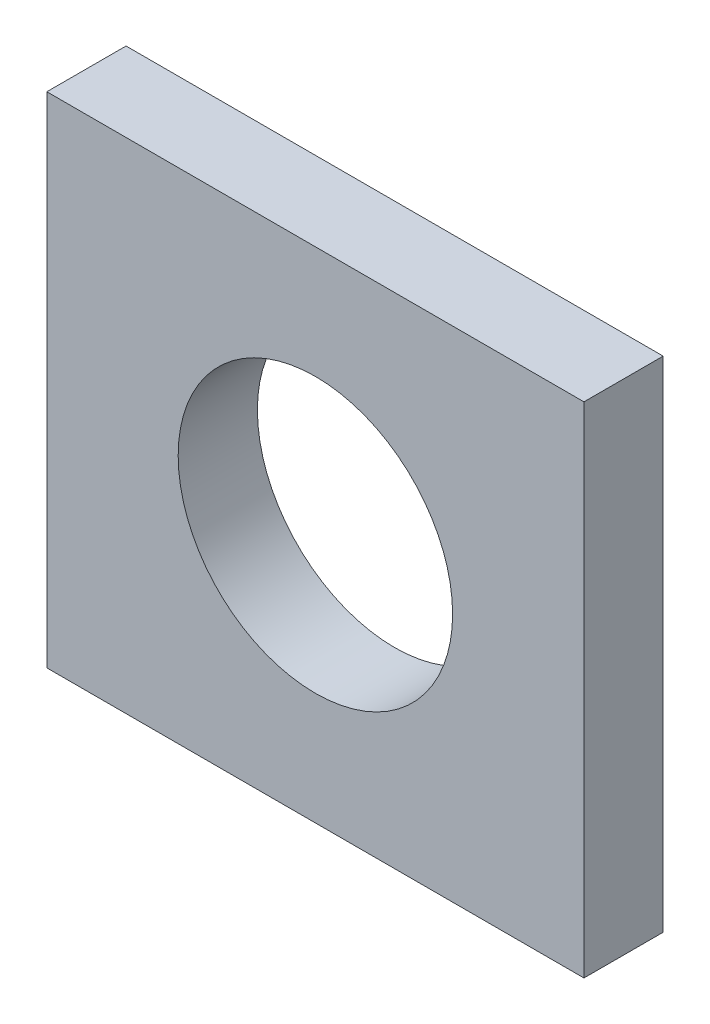
ISO-10303-21;
HEADER;
FILE_DESCRIPTION(('STEP AP214'),'2;1');
FILE_NAME('part.step','',(''),(''),'','','');
FILE_SCHEMA(('AUTOMOTIVE_DESIGN { 1 0 10303 214 1 1 1 1 }'));
ENDSEC;
DATA;
#1=APPLICATION_CONTEXT('core data for automotive mechanical design processes');
#2=APPLICATION_PROTOCOL_DEFINITION('international standard','automotive_design',2000,#1);
#3=PRODUCT_CONTEXT('',#1,'mechanical');
#4=PRODUCT('Part','Part','',(#3));
#5=PRODUCT_RELATED_PRODUCT_CATEGORY('part','',(#4));
#6=PRODUCT_DEFINITION_FORMATION('','',#4);
#7=PRODUCT_DEFINITION_CONTEXT('part definition',#1,'design');
#8=PRODUCT_DEFINITION('design','',#6,#7);
#9=PRODUCT_DEFINITION_SHAPE('','',#8);
#10=(LENGTH_UNIT() NAMED_UNIT(*) SI_UNIT(.MILLI.,.METRE.));
#11=(NAMED_UNIT(*) PLANE_ANGLE_UNIT() SI_UNIT($,.RADIAN.));
#12=(NAMED_UNIT(*) SI_UNIT($,.STERADIAN.) SOLID_ANGLE_UNIT());
#13=UNCERTAINTY_MEASURE_WITH_UNIT(LENGTH_MEASURE(1.E-05),#10,'distance_accuracy_value','');
#14=(GEOMETRIC_REPRESENTATION_CONTEXT(3) GLOBAL_UNCERTAINTY_ASSIGNED_CONTEXT((#13)) GLOBAL_UNIT_ASSIGNED_CONTEXT((#10,
#11,#12)) REPRESENTATION_CONTEXT('',''));
#15=CARTESIAN_POINT('',(0.,0.,0.));
#16=DIRECTION('',(0.,0.,1.));
#17=DIRECTION('',(1.,0.,0.));
#18=AXIS2_PLACEMENT_3D('',#15,#16,#17);
#19=CARTESIAN_POINT('',(-43.056347334884,40.,6.35));
#20=DIRECTION('',(1.,0.,0.));
#21=DIRECTION('',(0.,1.,0.));
#22=AXIS2_PLACEMENT_3D('',#19,#20,#21);
#23=PLANE('',#22);
#24=DIRECTION('',(0.,-1.,0.));
#25=VECTOR('',#24,1.);
#26=CARTESIAN_POINT('',(-43.056347334884,40.,0.));
#27=LINE('',#26,#25);
#28=CARTESIAN_POINT('',(-43.056347334884,40.,0.));
#29=VERTEX_POINT('',#28);
#30=CARTESIAN_POINT('',(-43.056347334884,0.,0.));
#31=VERTEX_POINT('',#30);
#32=EDGE_CURVE('E98',#29,#31,#27,.T.);
#33=ORIENTED_EDGE('',*,*,#32,.T.);
#34=DIRECTION('',(0.,0.,-1.));
#35=VECTOR('',#34,1.);
#36=CARTESIAN_POINT('',(-43.056347334884,0.,6.35));
#37=LINE('',#36,#35);
#38=CARTESIAN_POINT('',(-43.056347334884,0.,6.35));
#39=VERTEX_POINT('',#38);
#40=EDGE_CURVE('E11',#39,#31,#37,.T.);
#41=ORIENTED_EDGE('',*,*,#40,.F.);
#42=DIRECTION('',(0.,-1.,0.));
#43=VECTOR('',#42,1.);
#44=CARTESIAN_POINT('',(-43.056347334884,40.,6.35));
#45=LINE('',#44,#43);
#46=CARTESIAN_POINT('',(-43.056347334884,40.,6.35));
#47=VERTEX_POINT('',#46);
#48=EDGE_CURVE('E85',#47,#39,#45,.T.);
#49=ORIENTED_EDGE('',*,*,#48,.F.);
#50=DIRECTION('',(0.,0.,-1.));
#51=VECTOR('',#50,1.);
#52=CARTESIAN_POINT('',(-43.056347334884,40.,6.35));
#53=LINE('',#52,#51);
#54=EDGE_CURVE('E94',#47,#29,#53,.T.);
#55=ORIENTED_EDGE('',*,*,#54,.T.);
#56=EDGE_LOOP('',(#33,#41,#49,#55));
#57=FACE_BOUND('',#56,.T.);
#58=ADVANCED_FACE('F33',(#57),#23,.F.);
#59=CARTESIAN_POINT('',(-43.056347334884,0.,6.35));
#60=DIRECTION('',(0.,1.,0.));
#61=DIRECTION('',(0.,0.,1.));
#62=AXIS2_PLACEMENT_3D('',#59,#60,#61);
#63=PLANE('',#62);
#64=DIRECTION('',(1.,0.,0.));
#65=VECTOR('',#64,1.);
#66=CARTESIAN_POINT('',(-43.056347334884,0.,0.));
#67=LINE('',#66,#65);
#68=CARTESIAN_POINT('',(0.,0.,0.));
#69=VERTEX_POINT('',#68);
#70=EDGE_CURVE('E89',#31,#69,#67,.T.);
#71=ORIENTED_EDGE('',*,*,#70,.T.);
#72=DIRECTION('',(0.,0.,-1.));
#73=VECTOR('',#72,1.);
#74=CARTESIAN_POINT('',(0.,0.,6.35));
#75=LINE('',#74,#73);
#76=CARTESIAN_POINT('',(0.,0.,6.35));
#77=VERTEX_POINT('',#76);
#78=EDGE_CURVE('E42',#77,#69,#75,.T.);
#79=ORIENTED_EDGE('',*,*,#78,.F.);
#80=DIRECTION('',(1.,0.,0.));
#81=VECTOR('',#80,1.);
#82=CARTESIAN_POINT('',(-43.056347334884,0.,6.35));
#83=LINE('',#82,#81);
#84=EDGE_CURVE('E80',#39,#77,#83,.T.);
#85=ORIENTED_EDGE('',*,*,#84,.F.);
#86=ORIENTED_EDGE('',*,*,#40,.T.);
#87=EDGE_LOOP('',(#71,#79,#85,#86));
#88=FACE_BOUND('',#87,.T.);
#89=ADVANCED_FACE('F88',(#88),#63,.F.);
#90=CARTESIAN_POINT('',(0.,40.,6.35));
#91=DIRECTION('',(-1.,0.,0.));
#92=DIRECTION('',(0.,0.,1.));
#93=AXIS2_PLACEMENT_3D('',#90,#91,#92);
#94=PLANE('',#93);
#95=DIRECTION('',(0.,1.,0.));
#96=VECTOR('',#95,1.);
#97=CARTESIAN_POINT('',(0.,40.,0.));
#98=LINE('',#97,#96);
#99=CARTESIAN_POINT('',(0.,40.,0.));
#100=VERTEX_POINT('',#99);
#101=EDGE_CURVE('E67',#69,#100,#98,.T.);
#102=ORIENTED_EDGE('',*,*,#101,.T.);
#103=DIRECTION('',(0.,0.,-1.));
#104=VECTOR('',#103,1.);
#105=CARTESIAN_POINT('',(0.,40.,6.35));
#106=LINE('',#105,#104);
#107=CARTESIAN_POINT('',(0.,40.,6.35));
#108=VERTEX_POINT('',#107);
#109=EDGE_CURVE('E90',#108,#100,#106,.T.);
#110=ORIENTED_EDGE('',*,*,#109,.F.);
#111=DIRECTION('',(0.,1.,0.));
#112=VECTOR('',#111,1.);
#113=CARTESIAN_POINT('',(0.,40.,6.35));
#114=LINE('',#113,#112);
#115=EDGE_CURVE('E83',#77,#108,#114,.T.);
#116=ORIENTED_EDGE('',*,*,#115,.F.);
#117=ORIENTED_EDGE('',*,*,#78,.T.);
#118=EDGE_LOOP('',(#102,#110,#116,#117));
#119=FACE_BOUND('',#118,.T.);
#120=ADVANCED_FACE('F92',(#119),#94,.F.);
#121=CARTESIAN_POINT('',(-43.056347334884,40.,6.35));
#122=DIRECTION('',(0.,-1.,0.));
#123=DIRECTION('',(0.,0.,-1.));
#124=AXIS2_PLACEMENT_3D('',#121,#122,#123);
#125=PLANE('',#124);
#126=DIRECTION('',(-1.,0.,0.));
#127=VECTOR('',#126,1.);
#128=CARTESIAN_POINT('',(-43.056347334884,40.,0.));
#129=LINE('',#128,#127);
#130=EDGE_CURVE('E73',#100,#29,#129,.T.);
#131=ORIENTED_EDGE('',*,*,#130,.T.);
#132=ORIENTED_EDGE('',*,*,#54,.F.);
#133=DIRECTION('',(-1.,0.,0.));
#134=VECTOR('',#133,1.);
#135=CARTESIAN_POINT('',(-43.056347334884,40.,6.35));
#136=LINE('',#135,#134);
#137=EDGE_CURVE('E50',#108,#47,#136,.T.);
#138=ORIENTED_EDGE('',*,*,#137,.F.);
#139=ORIENTED_EDGE('',*,*,#109,.T.);
#140=EDGE_LOOP('',(#131,#132,#138,#139));
#141=FACE_BOUND('',#140,.T.);
#142=ADVANCED_FACE('F105',(#141),#125,.F.);
#143=CARTESIAN_POINT('',(0.,0.,6.35));
#144=DIRECTION('',(0.,0.,1.));
#145=DIRECTION('',(1.,0.,0.));
#146=AXIS2_PLACEMENT_3D('',#143,#144,#145);
#147=PLANE('',#146);
#148=CARTESIAN_POINT('',(-21.528173667442,20.,6.35));
#149=DIRECTION('',(0.,0.,1.));
#150=DIRECTION('',(1.,0.,0.));
#151=AXIS2_PLACEMENT_3D('',#148,#149,#150);
#152=CIRCLE('',#151,11.);
#153=CARTESIAN_POINT('',(-10.528173667442,20.,6.35));
#154=VERTEX_POINT('',#153);
#155=EDGE_CURVE('E111',#154,#154,#152,.T.);
#156=ORIENTED_EDGE('',*,*,#155,.F.);
#157=EDGE_LOOP('',(#156));
#158=FACE_BOUND('',#157,.T.);
#159=ORIENTED_EDGE('',*,*,#48,.T.);
#160=ORIENTED_EDGE('',*,*,#84,.T.);
#161=ORIENTED_EDGE('',*,*,#115,.T.);
#162=ORIENTED_EDGE('',*,*,#137,.T.);
#163=EDGE_LOOP('',(#159,#160,#161,#162));
#164=FACE_BOUND('',#163,.T.);
#165=ADVANCED_FACE('F81',(#158,#164),#147,.T.);
#166=CARTESIAN_POINT('',(0.,0.,0.));
#167=DIRECTION('',(0.,0.,1.));
#168=DIRECTION('',(1.,0.,0.));
#169=AXIS2_PLACEMENT_3D('',#166,#167,#168);
#170=PLANE('',#169);
#171=CARTESIAN_POINT('',(-21.528173667442,20.,0.));
#172=DIRECTION('',(0.,0.,1.));
#173=DIRECTION('',(1.,0.,0.));
#174=AXIS2_PLACEMENT_3D('',#171,#172,#173);
#175=CIRCLE('',#174,11.);
#176=CARTESIAN_POINT('',(-10.528173667442,20.,0.));
#177=VERTEX_POINT('',#176);
#178=EDGE_CURVE('E36',#177,#177,#175,.T.);
#179=ORIENTED_EDGE('',*,*,#178,.T.);
#180=EDGE_LOOP('',(#179));
#181=FACE_BOUND('',#180,.T.);
#182=ORIENTED_EDGE('',*,*,#32,.F.);
#183=ORIENTED_EDGE('',*,*,#130,.F.);
#184=ORIENTED_EDGE('',*,*,#101,.F.);
#185=ORIENTED_EDGE('',*,*,#70,.F.);
#186=EDGE_LOOP('',(#182,#183,#184,#185));
#187=FACE_BOUND('',#186,.T.);
#188=ADVANCED_FACE('F108',(#181,#187),#170,.F.);
#189=CARTESIAN_POINT('',(-21.528173667442,20.,-3.65));
#190=DIRECTION('',(0.,0.,1.));
#191=DIRECTION('',(1.,0.,0.));
#192=AXIS2_PLACEMENT_3D('',#189,#190,#191);
#193=CYLINDRICAL_SURFACE('',#192,11.);
#194=ORIENTED_EDGE('',*,*,#155,.T.);
#195=EDGE_LOOP('',(#194));
#196=FACE_BOUND('',#195,.T.);
#197=ORIENTED_EDGE('',*,*,#178,.F.);
#198=EDGE_LOOP('',(#197));
#199=FACE_BOUND('',#198,.T.);
#200=ADVANCED_FACE('F119',(#196,#199),#193,.F.);
#201=CLOSED_SHELL('',(#58,#89,#120,#142,#165,#188,#200));
#202=MANIFOLD_SOLID_BREP('B2',#201);
#203=ADVANCED_BREP_SHAPE_REPRESENTATION('',(#18,#202),#14);
#204=SHAPE_DEFINITION_REPRESENTATION(#9,#203);
ENDSEC;
END-ISO-10303-21;
